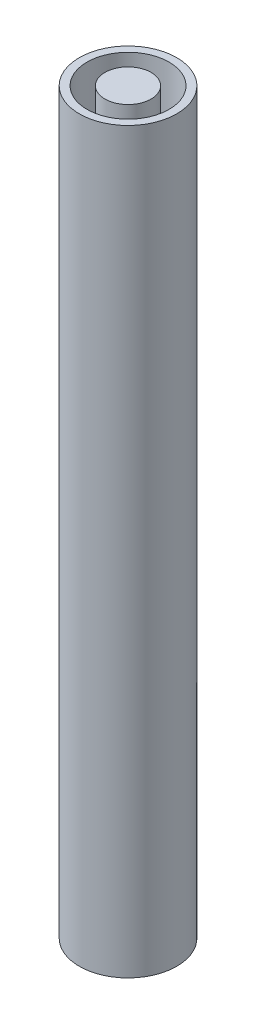
ISO-10303-21;
HEADER;
FILE_DESCRIPTION(('STEP AP214'),'2;1');
FILE_NAME('part.step','',(''),(''),'','','');
FILE_SCHEMA(('AUTOMOTIVE_DESIGN { 1 0 10303 214 1 1 1 1 }'));
ENDSEC;
DATA;
#1=APPLICATION_CONTEXT('core data for automotive mechanical design processes');
#2=APPLICATION_PROTOCOL_DEFINITION('international standard','automotive_design',2000,#1);
#3=PRODUCT_CONTEXT('',#1,'mechanical');
#4=PRODUCT('Part','Part','',(#3));
#5=PRODUCT_RELATED_PRODUCT_CATEGORY('part','',(#4));
#6=PRODUCT_DEFINITION_FORMATION('','',#4);
#7=PRODUCT_DEFINITION_CONTEXT('part definition',#1,'design');
#8=PRODUCT_DEFINITION('design','',#6,#7);
#9=PRODUCT_DEFINITION_SHAPE('','',#8);
#10=(LENGTH_UNIT() NAMED_UNIT(*) SI_UNIT(.MILLI.,.METRE.));
#11=(NAMED_UNIT(*) PLANE_ANGLE_UNIT() SI_UNIT($,.RADIAN.));
#12=(NAMED_UNIT(*) SI_UNIT($,.STERADIAN.) SOLID_ANGLE_UNIT());
#13=UNCERTAINTY_MEASURE_WITH_UNIT(LENGTH_MEASURE(1.E-05),#10,'distance_accuracy_value','');
#14=(GEOMETRIC_REPRESENTATION_CONTEXT(3) GLOBAL_UNCERTAINTY_ASSIGNED_CONTEXT((#13)) GLOBAL_UNIT_ASSIGNED_CONTEXT((#10,
#11,#12)) REPRESENTATION_CONTEXT('',''));
#15=CARTESIAN_POINT('',(0.,0.,0.));
#16=DIRECTION('',(0.,0.,1.));
#17=DIRECTION('',(1.,0.,0.));
#18=AXIS2_PLACEMENT_3D('',#15,#16,#17);
#19=CARTESIAN_POINT('',(0.,0.,0.));
#20=DIRECTION('',(0.,-1.,0.));
#21=DIRECTION('',(0.,0.,-1.));
#22=AXIS2_PLACEMENT_3D('',#19,#20,#21);
#23=CYLINDRICAL_SURFACE('',#22,50.8);
#24=CARTESIAN_POINT('',(0.,0.,0.));
#25=DIRECTION('',(0.,-1.,0.));
#26=DIRECTION('',(0.,0.,-1.));
#27=AXIS2_PLACEMENT_3D('',#24,#25,#26);
#28=CIRCLE('',#27,50.8);
#29=CARTESIAN_POINT('',(0.,0.,-50.8));
#30=VERTEX_POINT('',#29);
#31=EDGE_CURVE('E11',#30,#30,#28,.T.);
#32=ORIENTED_EDGE('',*,*,#31,.T.);
#33=EDGE_LOOP('',(#32));
#34=FACE_BOUND('',#33,.T.);
#35=CARTESIAN_POINT('',(0.,914.4,0.));
#36=DIRECTION('',(0.,-1.,0.));
#37=DIRECTION('',(0.,0.,-1.));
#38=AXIS2_PLACEMENT_3D('',#35,#36,#37);
#39=CIRCLE('',#38,50.8);
#40=CARTESIAN_POINT('',(0.,914.4,-50.8));
#41=VERTEX_POINT('',#40);
#42=EDGE_CURVE('E54',#41,#41,#39,.T.);
#43=ORIENTED_EDGE('',*,*,#42,.F.);
#44=EDGE_LOOP('',(#43));
#45=FACE_BOUND('',#44,.T.);
#46=ADVANCED_FACE('F40',(#34,#45),#23,.F.);
#47=CARTESIAN_POINT('',(50.8,0.,0.));
#48=DIRECTION('',(0.,-1.,0.));
#49=DIRECTION('',(0.,0.,-1.));
#50=AXIS2_PLACEMENT_3D('',#47,#48,#49);
#51=PLANE('',#50);
#52=CARTESIAN_POINT('',(0.,0.,0.));
#53=DIRECTION('',(0.,-1.,0.));
#54=DIRECTION('',(0.,0.,-1.));
#55=AXIS2_PLACEMENT_3D('',#52,#53,#54);
#56=CIRCLE('',#55,60.325);
#57=CARTESIAN_POINT('',(0.,0.,-60.325));
#58=VERTEX_POINT('',#57);
#59=EDGE_CURVE('E46',#58,#58,#56,.T.);
#60=ORIENTED_EDGE('',*,*,#59,.T.);
#61=EDGE_LOOP('',(#60));
#62=FACE_BOUND('',#61,.T.);
#63=ORIENTED_EDGE('',*,*,#31,.F.);
#64=EDGE_LOOP('',(#63));
#65=FACE_BOUND('',#64,.T.);
#66=ADVANCED_FACE('F64',(#62,#65),#51,.T.);
#67=CARTESIAN_POINT('',(0.,0.,0.));
#68=DIRECTION('',(0.,-1.,0.));
#69=DIRECTION('',(0.,0.,-1.));
#70=AXIS2_PLACEMENT_3D('',#67,#68,#69);
#71=CYLINDRICAL_SURFACE('',#70,60.325);
#72=CARTESIAN_POINT('',(0.,914.4,0.));
#73=DIRECTION('',(0.,-1.,0.));
#74=DIRECTION('',(0.,0.,-1.));
#75=AXIS2_PLACEMENT_3D('',#72,#73,#74);
#76=CIRCLE('',#75,60.325);
#77=CARTESIAN_POINT('',(0.,914.4,-60.325));
#78=VERTEX_POINT('',#77);
#79=EDGE_CURVE('E50',#78,#78,#76,.T.);
#80=ORIENTED_EDGE('',*,*,#79,.T.);
#81=EDGE_LOOP('',(#80));
#82=FACE_BOUND('',#81,.T.);
#83=ORIENTED_EDGE('',*,*,#59,.F.);
#84=EDGE_LOOP('',(#83));
#85=FACE_BOUND('',#84,.T.);
#86=ADVANCED_FACE('F68',(#82,#85),#71,.T.);
#87=CARTESIAN_POINT('',(50.8,914.4,0.));
#88=DIRECTION('',(0.,1.,0.));
#89=DIRECTION('',(0.,0.,1.));
#90=AXIS2_PLACEMENT_3D('',#87,#88,#89);
#91=PLANE('',#90);
#92=ORIENTED_EDGE('',*,*,#42,.T.);
#93=EDGE_LOOP('',(#92));
#94=FACE_BOUND('',#93,.T.);
#95=ORIENTED_EDGE('',*,*,#79,.F.);
#96=EDGE_LOOP('',(#95));
#97=FACE_BOUND('',#96,.T.);
#98=ADVANCED_FACE('F60',(#94,#97),#91,.T.);
#99=CLOSED_SHELL('',(#46,#66,#86,#98));
#100=MANIFOLD_SOLID_BREP('B2',#99);
#101=CARTESIAN_POINT('',(28.575,0.,0.));
#102=DIRECTION('',(0.,-1.,0.));
#103=DIRECTION('',(0.,0.,-1.));
#104=AXIS2_PLACEMENT_3D('',#101,#102,#103);
#105=PLANE('',#104);
#106=CARTESIAN_POINT('',(0.,0.,0.));
#107=DIRECTION('',(0.,-1.,0.));
#108=DIRECTION('',(0.,0.,-1.));
#109=AXIS2_PLACEMENT_3D('',#106,#107,#108);
#110=CIRCLE('',#109,28.575);
#111=CARTESIAN_POINT('',(0.,0.,-28.575));
#112=VERTEX_POINT('',#111);
#113=EDGE_CURVE('E39',#112,#112,#110,.T.);
#114=ORIENTED_EDGE('',*,*,#113,.T.);
#115=EDGE_LOOP('',(#114));
#116=FACE_BOUND('',#115,.T.);
#117=ADVANCED_FACE('F101',(#116),#105,.T.);
#118=CARTESIAN_POINT('',(0.,0.,0.));
#119=DIRECTION('',(0.,-1.,0.));
#120=DIRECTION('',(0.,0.,-1.));
#121=AXIS2_PLACEMENT_3D('',#118,#119,#120);
#122=CYLINDRICAL_SURFACE('',#121,28.575);
#123=CARTESIAN_POINT('',(0.,914.4,0.));
#124=DIRECTION('',(0.,-1.,0.));
#125=DIRECTION('',(0.,0.,-1.));
#126=AXIS2_PLACEMENT_3D('',#123,#124,#125);
#127=CIRCLE('',#126,28.575);
#128=CARTESIAN_POINT('',(0.,914.4,-28.575));
#129=VERTEX_POINT('',#128);
#130=EDGE_CURVE('E107',#129,#129,#127,.T.);
#131=ORIENTED_EDGE('',*,*,#130,.T.);
#132=EDGE_LOOP('',(#131));
#133=FACE_BOUND('',#132,.T.);
#134=ORIENTED_EDGE('',*,*,#113,.F.);
#135=EDGE_LOOP('',(#134));
#136=FACE_BOUND('',#135,.T.);
#137=ADVANCED_FACE('F113',(#133,#136),#122,.T.);
#138=CARTESIAN_POINT('',(28.575,914.4,0.));
#139=DIRECTION('',(0.,1.,0.));
#140=DIRECTION('',(0.,0.,1.));
#141=AXIS2_PLACEMENT_3D('',#138,#139,#140);
#142=PLANE('',#141);
#143=ORIENTED_EDGE('',*,*,#130,.F.);
#144=EDGE_LOOP('',(#143));
#145=FACE_BOUND('',#144,.T.);
#146=ADVANCED_FACE('F116',(#145),#142,.T.);
#147=CLOSED_SHELL('',(#117,#137,#146));
#148=MANIFOLD_SOLID_BREP('B6',#147);
#149=ADVANCED_BREP_SHAPE_REPRESENTATION('',(#18,#100,#148),#14);
#150=SHAPE_DEFINITION_REPRESENTATION(#9,#149);
ENDSEC;
END-ISO-10303-21;
